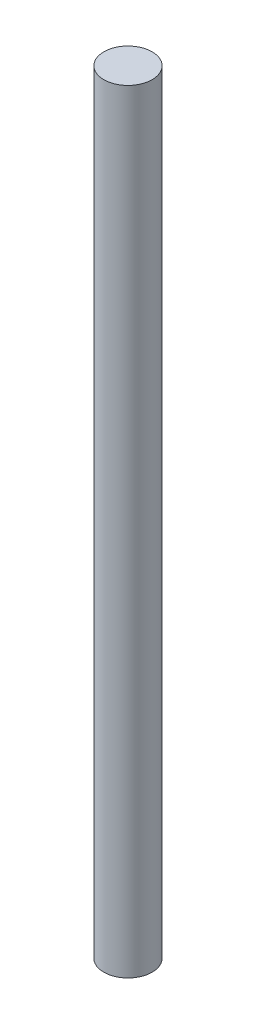
ISO-10303-21;
HEADER;
FILE_DESCRIPTION(('STEP AP214'),'2;1');
FILE_NAME('part.step','',(''),(''),'','','');
FILE_SCHEMA(('AUTOMOTIVE_DESIGN { 1 0 10303 214 1 1 1 1 }'));
ENDSEC;
DATA;
#1=APPLICATION_CONTEXT('core data for automotive mechanical design processes');
#2=APPLICATION_PROTOCOL_DEFINITION('international standard','automotive_design',2000,#1);
#3=PRODUCT_CONTEXT('',#1,'mechanical');
#4=PRODUCT('Part','Part','',(#3));
#5=PRODUCT_RELATED_PRODUCT_CATEGORY('part','',(#4));
#6=PRODUCT_DEFINITION_FORMATION('','',#4);
#7=PRODUCT_DEFINITION_CONTEXT('part definition',#1,'design');
#8=PRODUCT_DEFINITION('design','',#6,#7);
#9=PRODUCT_DEFINITION_SHAPE('','',#8);
#10=(LENGTH_UNIT() NAMED_UNIT(*) SI_UNIT(.MILLI.,.METRE.));
#11=(NAMED_UNIT(*) PLANE_ANGLE_UNIT() SI_UNIT($,.RADIAN.));
#12=(NAMED_UNIT(*) SI_UNIT($,.STERADIAN.) SOLID_ANGLE_UNIT());
#13=UNCERTAINTY_MEASURE_WITH_UNIT(LENGTH_MEASURE(1.E-05),#10,'distance_accuracy_value','');
#14=(GEOMETRIC_REPRESENTATION_CONTEXT(3) GLOBAL_UNCERTAINTY_ASSIGNED_CONTEXT((#13)) GLOBAL_UNIT_ASSIGNED_CONTEXT((#10,
#11,#12)) REPRESENTATION_CONTEXT('',''));
#15=CARTESIAN_POINT('',(0.,0.,0.));
#16=DIRECTION('',(0.,0.,1.));
#17=DIRECTION('',(1.,0.,0.));
#18=AXIS2_PLACEMENT_3D('',#15,#16,#17);
#19=CARTESIAN_POINT('',(0.,200.,0.));
#20=DIRECTION('',(0.,-1.,0.));
#21=DIRECTION('',(0.,0.,-1.));
#22=AXIS2_PLACEMENT_3D('',#19,#20,#21);
#23=CYLINDRICAL_SURFACE('',#22,12.5);
#24=CARTESIAN_POINT('',(0.,200.,0.));
#25=DIRECTION('',(0.,1.,0.));
#26=DIRECTION('',(0.,0.,1.));
#27=AXIS2_PLACEMENT_3D('',#24,#25,#26);
#28=CIRCLE('',#27,12.5);
#29=CARTESIAN_POINT('',(0.,200.,12.5));
#30=VERTEX_POINT('',#29);
#31=EDGE_CURVE('E10',#30,#30,#28,.T.);
#32=ORIENTED_EDGE('',*,*,#31,.F.);
#33=EDGE_LOOP('',(#32));
#34=FACE_BOUND('',#33,.T.);
#35=CARTESIAN_POINT('',(0.,-200.,0.));
#36=DIRECTION('',(0.,1.,0.));
#37=DIRECTION('',(0.,0.,1.));
#38=AXIS2_PLACEMENT_3D('',#35,#36,#37);
#39=CIRCLE('',#38,12.5);
#40=CARTESIAN_POINT('',(0.,-200.,12.5));
#41=VERTEX_POINT('',#40);
#42=EDGE_CURVE('E44',#41,#41,#39,.T.);
#43=ORIENTED_EDGE('',*,*,#42,.T.);
#44=EDGE_LOOP('',(#43));
#45=FACE_BOUND('',#44,.T.);
#46=ADVANCED_FACE('F41',(#34,#45),#23,.T.);
#47=CARTESIAN_POINT('',(0.,200.,0.));
#48=DIRECTION('',(0.,1.,0.));
#49=DIRECTION('',(0.,0.,1.));
#50=AXIS2_PLACEMENT_3D('',#47,#48,#49);
#51=PLANE('',#50);
#52=ORIENTED_EDGE('',*,*,#31,.T.);
#53=EDGE_LOOP('',(#52));
#54=FACE_BOUND('',#53,.T.);
#55=ADVANCED_FACE('F58',(#54),#51,.T.);
#56=CARTESIAN_POINT('',(0.,-200.,0.));
#57=DIRECTION('',(0.,1.,0.));
#58=DIRECTION('',(0.,0.,1.));
#59=AXIS2_PLACEMENT_3D('',#56,#57,#58);
#60=PLANE('',#59);
#61=ORIENTED_EDGE('',*,*,#42,.F.);
#62=EDGE_LOOP('',(#61));
#63=FACE_BOUND('',#62,.T.);
#64=ADVANCED_FACE('F56',(#63),#60,.F.);
#65=CLOSED_SHELL('',(#46,#55,#64));
#66=MANIFOLD_SOLID_BREP('B2',#65);
#67=ADVANCED_BREP_SHAPE_REPRESENTATION('',(#18,#66),#14);
#68=SHAPE_DEFINITION_REPRESENTATION(#9,#67);
ENDSEC;
END-ISO-10303-21;
